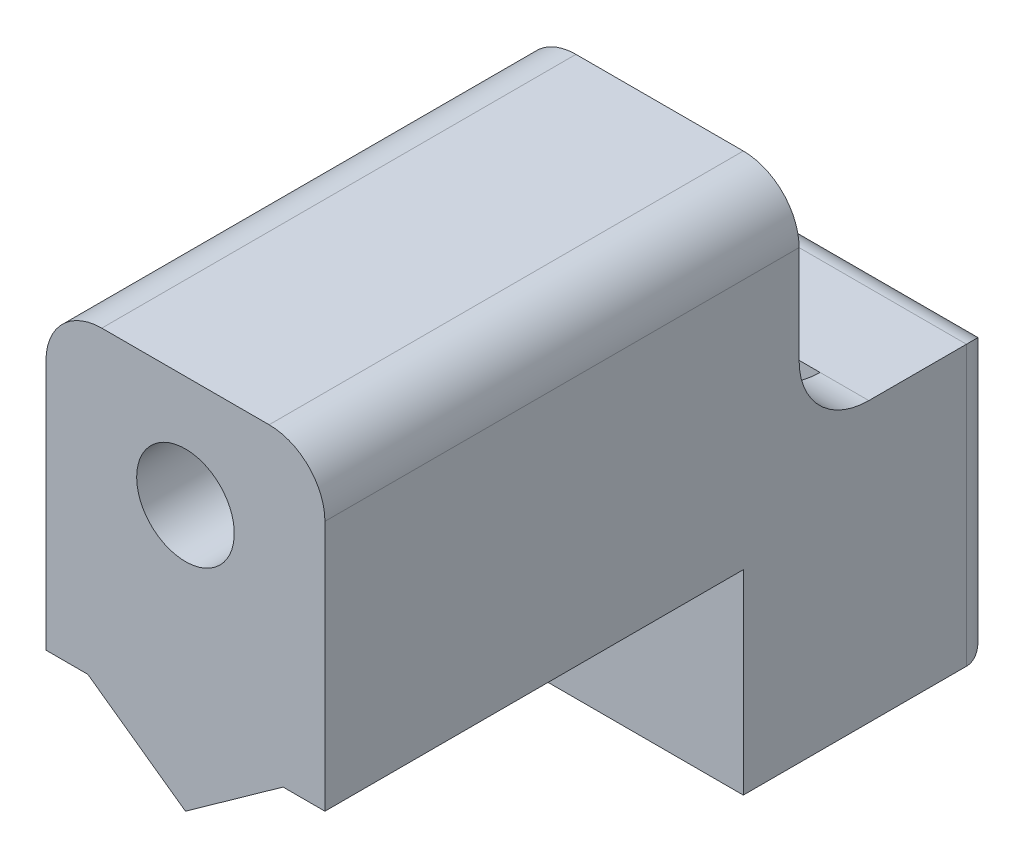
ISO-10303-21;
HEADER;
FILE_DESCRIPTION(('STEP AP214'),'2;1');
FILE_NAME('part.step','',(''),(''),'','','');
FILE_SCHEMA(('AUTOMOTIVE_DESIGN { 1 0 10303 214 1 1 1 1 }'));
ENDSEC;
DATA;
#1=APPLICATION_CONTEXT('core data for automotive mechanical design processes');
#2=APPLICATION_PROTOCOL_DEFINITION('international standard','automotive_design',2000,#1);
#3=PRODUCT_CONTEXT('',#1,'mechanical');
#4=PRODUCT('Part','Part','',(#3));
#5=PRODUCT_RELATED_PRODUCT_CATEGORY('part','',(#4));
#6=PRODUCT_DEFINITION_FORMATION('','',#4);
#7=PRODUCT_DEFINITION_CONTEXT('part definition',#1,'design');
#8=PRODUCT_DEFINITION('design','',#6,#7);
#9=PRODUCT_DEFINITION_SHAPE('','',#8);
#10=(LENGTH_UNIT() NAMED_UNIT(*) SI_UNIT(.MILLI.,.METRE.));
#11=(NAMED_UNIT(*) PLANE_ANGLE_UNIT() SI_UNIT($,.RADIAN.));
#12=(NAMED_UNIT(*) SI_UNIT($,.STERADIAN.) SOLID_ANGLE_UNIT());
#13=UNCERTAINTY_MEASURE_WITH_UNIT(LENGTH_MEASURE(1.E-05),#10,'distance_accuracy_value','');
#14=(GEOMETRIC_REPRESENTATION_CONTEXT(3) GLOBAL_UNCERTAINTY_ASSIGNED_CONTEXT((#13)) GLOBAL_UNIT_ASSIGNED_CONTEXT((#10,
#11,#12)) REPRESENTATION_CONTEXT('',''));
#15=CARTESIAN_POINT('',(0.,0.,0.));
#16=DIRECTION('',(0.,0.,1.));
#17=DIRECTION('',(1.,0.,0.));
#18=AXIS2_PLACEMENT_3D('',#15,#16,#17);
#19=CARTESIAN_POINT('',(-3.5,-4.24999999999999,7.));
#20=DIRECTION('',(0.,1.,0.));
#21=DIRECTION('',(0.,0.,1.));
#22=AXIS2_PLACEMENT_3D('',#19,#20,#21);
#23=PLANE('',#22);
#24=DIRECTION('',(-1.,0.,0.));
#25=VECTOR('',#24,1.);
#26=CARTESIAN_POINT('',(-5.,-4.24999999999999,2.));
#27=LINE('',#26,#25);
#28=CARTESIAN_POINT('',(5.,-4.24999999999999,2.));
#29=VERTEX_POINT('',#28);
#30=CARTESIAN_POINT('',(3.49999999999999,-4.24999999999999,2.));
#31=VERTEX_POINT('',#30);
#32=EDGE_CURVE('E298',#29,#31,#27,.T.);
#33=ORIENTED_EDGE('',*,*,#32,.F.);
#34=DIRECTION('',(0.,0.,-1.));
#35=VECTOR('',#34,1.);
#36=CARTESIAN_POINT('',(5.,-4.24999999999999,7.));
#37=LINE('',#36,#35);
#38=CARTESIAN_POINT('',(5.,-4.24999999999999,17.));
#39=VERTEX_POINT('',#38);
#40=EDGE_CURVE('E444',#39,#29,#37,.T.);
#41=ORIENTED_EDGE('',*,*,#40,.F.);
#42=DIRECTION('',(1.,0.,0.));
#43=VECTOR('',#42,1.);
#44=CARTESIAN_POINT('',(0.,-4.24999999999998,17.));
#45=LINE('',#44,#43);
#46=CARTESIAN_POINT('',(3.5,-4.24999999999999,17.));
#47=VERTEX_POINT('',#46);
#48=EDGE_CURVE('E302',#47,#39,#45,.T.);
#49=ORIENTED_EDGE('',*,*,#48,.F.);
#50=DIRECTION('',(0.,0.,-1.));
#51=VECTOR('',#50,1.);
#52=CARTESIAN_POINT('',(3.5,-4.24999999999999,7.));
#53=LINE('',#52,#51);
#54=EDGE_CURVE('E405',#47,#31,#53,.T.);
#55=ORIENTED_EDGE('',*,*,#54,.T.);
#56=EDGE_LOOP('',(#33,#41,#49,#55));
#57=FACE_BOUND('',#56,.T.);
#58=ADVANCED_FACE('F35',(#57),#23,.F.);
#59=CARTESIAN_POINT('',(-3.5,-4.24999999999999,2.));
#60=VERTEX_POINT('',#59);
#61=CARTESIAN_POINT('',(-5.,-4.24999999999999,2.));
#62=VERTEX_POINT('',#61);
#63=EDGE_CURVE('E297',#60,#62,#27,.T.);
#64=ORIENTED_EDGE('',*,*,#63,.F.);
#65=DIRECTION('',(0.,0.,-1.));
#66=VECTOR('',#65,1.);
#67=CARTESIAN_POINT('',(-3.5,-4.24999999999999,7.));
#68=LINE('',#67,#66);
#69=CARTESIAN_POINT('',(-3.5,-4.24999999999999,17.));
#70=VERTEX_POINT('',#69);
#71=EDGE_CURVE('E455',#70,#60,#68,.T.);
#72=ORIENTED_EDGE('',*,*,#71,.F.);
#73=DIRECTION('',(1.,0.,0.));
#74=VECTOR('',#73,1.);
#75=CARTESIAN_POINT('',(0.,-4.24999999999999,17.));
#76=LINE('',#75,#74);
#77=CARTESIAN_POINT('',(-5.,-4.24999999999999,17.));
#78=VERTEX_POINT('',#77);
#79=EDGE_CURVE('E320',#78,#70,#76,.T.);
#80=ORIENTED_EDGE('',*,*,#79,.F.);
#81=DIRECTION('',(0.,0.,-1.));
#82=VECTOR('',#81,1.);
#83=CARTESIAN_POINT('',(-5.,-4.24999999999999,7.));
#84=LINE('',#83,#82);
#85=EDGE_CURVE('E449',#78,#62,#84,.T.);
#86=ORIENTED_EDGE('',*,*,#85,.T.);
#87=EDGE_LOOP('',(#64,#72,#80,#86));
#88=FACE_BOUND('',#87,.T.);
#89=ADVANCED_FACE('F558',(#88),#23,.F.);
#90=CARTESIAN_POINT('',(3.5,-4.24999999999999,7.));
#91=DIRECTION('',(-0.581238193719097,0.813733471206735,0.));
#92=DIRECTION('',(-0.813733471206735,-0.581238193719097,0.));
#93=AXIS2_PLACEMENT_3D('',#90,#91,#92);
#94=PLANE('',#93);
#95=DIRECTION('',(-0.813733471206735,-0.581238193719097,0.));
#96=VECTOR('',#95,1.);
#97=CARTESIAN_POINT('',(3.5,-4.24999999999999,2.));
#98=LINE('',#97,#96);
#99=CARTESIAN_POINT('',(0.,-6.74999999999999,2.));
#100=VERTEX_POINT('',#99);
#101=EDGE_CURVE('E300',#31,#100,#98,.T.);
#102=ORIENTED_EDGE('',*,*,#101,.F.);
#103=ORIENTED_EDGE('',*,*,#54,.F.);
#104=DIRECTION('',(0.813733471206734,0.581238193719097,0.));
#105=VECTOR('',#104,1.);
#106=CARTESIAN_POINT('',(3.19256756756757,-4.46959459459458,17.));
#107=LINE('',#106,#105);
#108=CARTESIAN_POINT('',(0.,-6.74999999999999,17.));
#109=VERTEX_POINT('',#108);
#110=EDGE_CURVE('E326',#109,#47,#107,.T.);
#111=ORIENTED_EDGE('',*,*,#110,.F.);
#112=DIRECTION('',(0.,0.,-1.));
#113=VECTOR('',#112,1.);
#114=CARTESIAN_POINT('',(0.,-6.74999999999999,7.));
#115=LINE('',#114,#113);
#116=EDGE_CURVE('E460',#109,#100,#115,.T.);
#117=ORIENTED_EDGE('',*,*,#116,.T.);
#118=EDGE_LOOP('',(#102,#103,#111,#117));
#119=FACE_BOUND('',#118,.T.);
#120=ADVANCED_FACE('F546',(#119),#94,.F.);
#121=CARTESIAN_POINT('',(0.,-6.74999999999999,7.));
#122=DIRECTION('',(0.581238193719096,0.813733471206735,0.));
#123=DIRECTION('',(-0.813733471206735,0.581238193719096,0.));
#124=AXIS2_PLACEMENT_3D('',#121,#122,#123);
#125=PLANE('',#124);
#126=DIRECTION('',(-0.813733471206735,0.581238193719096,0.));
#127=VECTOR('',#126,1.);
#128=CARTESIAN_POINT('',(0.,-6.74999999999999,2.));
#129=LINE('',#128,#127);
#130=EDGE_CURVE('E11',#100,#60,#129,.T.);
#131=ORIENTED_EDGE('',*,*,#130,.F.);
#132=ORIENTED_EDGE('',*,*,#116,.F.);
#133=DIRECTION('',(0.813733471206735,-0.581238193719097,0.));
#134=VECTOR('',#133,1.);
#135=CARTESIAN_POINT('',(-3.19256756756757,-4.46959459459459,17.));
#136=LINE('',#135,#134);
#137=EDGE_CURVE('E323',#70,#109,#136,.T.);
#138=ORIENTED_EDGE('',*,*,#137,.F.);
#139=ORIENTED_EDGE('',*,*,#71,.T.);
#140=EDGE_LOOP('',(#131,#132,#138,#139));
#141=FACE_BOUND('',#140,.T.);
#142=ADVANCED_FACE('F548',(#141),#125,.F.);
#143=CARTESIAN_POINT('',(0.,0.,0.));
#144=DIRECTION('',(0.,0.,-1.));
#145=DIRECTION('',(-1.,0.,0.));
#146=AXIS2_PLACEMENT_3D('',#143,#144,#145);
#147=PLANE('',#146);
#148=DIRECTION('',(-1.,0.,0.));
#149=VECTOR('',#148,1.);
#150=CARTESIAN_POINT('',(1.64544826719043,-0.0999999999999942,0.));
#151=LINE('',#150,#149);
#152=CARTESIAN_POINT('',(1.64544826719043,-0.0999999999999942,0.));
#153=VERTEX_POINT('',#152);
#154=CARTESIAN_POINT('',(-1.64544826719043,-0.0999999999999952,0.));
#155=VERTEX_POINT('',#154);
#156=EDGE_CURVE('E50',#153,#155,#151,.T.);
#157=ORIENTED_EDGE('',*,*,#156,.F.);
#158=DIRECTION('',(-0.5,-0.866025403784439,0.));
#159=VECTOR('',#158,1.);
#160=CARTESIAN_POINT('',(3.29089653438087,2.75000000000001,0.));
#161=LINE('',#160,#159);
#162=CARTESIAN_POINT('',(3.29089653438087,2.75000000000001,0.));
#163=VERTEX_POINT('',#162);
#164=EDGE_CURVE('E252',#163,#153,#161,.T.);
#165=ORIENTED_EDGE('',*,*,#164,.F.);
#166=DIRECTION('',(0.5,-0.866025403784439,0.));
#167=VECTOR('',#166,1.);
#168=CARTESIAN_POINT('',(1.64544826719043,5.60000000000001,0.));
#169=LINE('',#168,#167);
#170=CARTESIAN_POINT('',(1.64544826719043,5.60000000000001,0.));
#171=VERTEX_POINT('',#170);
#172=EDGE_CURVE('E255',#171,#163,#169,.T.);
#173=ORIENTED_EDGE('',*,*,#172,.F.);
#174=DIRECTION('',(1.,0.,0.));
#175=VECTOR('',#174,1.);
#176=CARTESIAN_POINT('',(-1.64544826719043,5.60000000000001,0.));
#177=LINE('',#176,#175);
#178=CARTESIAN_POINT('',(-1.64544826719043,5.60000000000001,0.));
#179=VERTEX_POINT('',#178);
#180=EDGE_CURVE('E275',#179,#171,#177,.T.);
#181=ORIENTED_EDGE('',*,*,#180,.F.);
#182=DIRECTION('',(0.5,0.866025403784439,0.));
#183=VECTOR('',#182,1.);
#184=CARTESIAN_POINT('',(-3.29089653438087,2.75000000000001,0.));
#185=LINE('',#184,#183);
#186=CARTESIAN_POINT('',(-3.29089653438087,2.75000000000001,0.));
#187=VERTEX_POINT('',#186);
#188=EDGE_CURVE('E272',#187,#179,#185,.T.);
#189=ORIENTED_EDGE('',*,*,#188,.F.);
#190=DIRECTION('',(-0.5,0.866025403784439,0.));
#191=VECTOR('',#190,1.);
#192=CARTESIAN_POINT('',(-1.64544826719043,-0.0999999999999951,0.));
#193=LINE('',#192,#191);
#194=EDGE_CURVE('E269',#155,#187,#193,.T.);
#195=ORIENTED_EDGE('',*,*,#194,.F.);
#196=EDGE_LOOP('',(#157,#165,#173,#181,#189,#195));
#197=FACE_BOUND('',#196,.T.);
#198=DIRECTION('',(-1.,0.,0.));
#199=VECTOR('',#198,1.);
#200=CARTESIAN_POINT('',(3.25,1.25000000000001,0.));
#201=LINE('',#200,#199);
#202=CARTESIAN_POINT('',(5.,1.25000000000001,0.));
#203=VERTEX_POINT('',#202);
#204=CARTESIAN_POINT('',(3.25,1.25,0.));
#205=VERTEX_POINT('',#204);
#206=EDGE_CURVE('E404',#203,#205,#201,.T.);
#207=ORIENTED_EDGE('',*,*,#206,.T.);
#208=DIRECTION('',(0.,-1.,0.));
#209=VECTOR('',#208,1.);
#210=CARTESIAN_POINT('',(3.25,0.,0.));
#211=LINE('',#210,#209);
#212=CARTESIAN_POINT('',(3.25,-7.44999999999999,0.));
#213=VERTEX_POINT('',#212);
#214=EDGE_CURVE('E360',#205,#213,#211,.T.);
#215=ORIENTED_EDGE('',*,*,#214,.T.);
#216=DIRECTION('',(1.,0.,0.));
#217=VECTOR('',#216,1.);
#218=CARTESIAN_POINT('',(-3.25,-7.44999999999999,0.));
#219=LINE('',#218,#217);
#220=CARTESIAN_POINT('',(-3.25,-7.44999999999999,0.));
#221=VERTEX_POINT('',#220);
#222=EDGE_CURVE('E330',#221,#213,#219,.T.);
#223=ORIENTED_EDGE('',*,*,#222,.F.);
#224=DIRECTION('',(0.,1.,0.));
#225=VECTOR('',#224,1.);
#226=CARTESIAN_POINT('',(-3.25,0.,0.));
#227=LINE('',#226,#225);
#228=CARTESIAN_POINT('',(-3.25,1.25,0.));
#229=VERTEX_POINT('',#228);
#230=EDGE_CURVE('E362',#221,#229,#227,.T.);
#231=ORIENTED_EDGE('',*,*,#230,.T.);
#232=DIRECTION('',(-1.,0.,0.));
#233=VECTOR('',#232,1.);
#234=CARTESIAN_POINT('',(-5.,1.25000000000001,0.));
#235=LINE('',#234,#233);
#236=CARTESIAN_POINT('',(-5.,1.25000000000001,0.));
#237=VERTEX_POINT('',#236);
#238=EDGE_CURVE('E401',#229,#237,#235,.T.);
#239=ORIENTED_EDGE('',*,*,#238,.T.);
#240=DIRECTION('',(0.,-1.,0.));
#241=VECTOR('',#240,1.);
#242=CARTESIAN_POINT('',(-5.,-4.24999999999999,0.));
#243=LINE('',#242,#241);
#244=CARTESIAN_POINT('',(-5.,4.74999999999999,0.));
#245=VERTEX_POINT('',#244);
#246=EDGE_CURVE('E466',#245,#237,#243,.T.);
#247=ORIENTED_EDGE('',*,*,#246,.F.);
#248=CARTESIAN_POINT('',(-3.,4.74999999999999,0.));
#249=DIRECTION('',(0.,0.,-1.));
#250=DIRECTION('',(-1.,0.,0.));
#251=AXIS2_PLACEMENT_3D('',#248,#249,#250);
#252=CIRCLE('',#251,2.);
#253=CARTESIAN_POINT('',(-3.,6.74999999999999,0.));
#254=VERTEX_POINT('',#253);
#255=EDGE_CURVE('E58',#245,#254,#252,.T.);
#256=ORIENTED_EDGE('',*,*,#255,.T.);
#257=DIRECTION('',(-1.,0.,0.));
#258=VECTOR('',#257,1.);
#259=CARTESIAN_POINT('',(-5.,6.74999999999999,0.));
#260=LINE('',#259,#258);
#261=CARTESIAN_POINT('',(3.,6.74999999999999,0.));
#262=VERTEX_POINT('',#261);
#263=EDGE_CURVE('E391',#262,#254,#260,.T.);
#264=ORIENTED_EDGE('',*,*,#263,.F.);
#265=CARTESIAN_POINT('',(3.,4.74999999999999,0.));
#266=DIRECTION('',(0.,0.,-1.));
#267=DIRECTION('',(-1.,0.,0.));
#268=AXIS2_PLACEMENT_3D('',#265,#266,#267);
#269=CIRCLE('',#268,2.);
#270=CARTESIAN_POINT('',(5.,4.74999999999999,0.));
#271=VERTEX_POINT('',#270);
#272=EDGE_CURVE('E477',#262,#271,#269,.T.);
#273=ORIENTED_EDGE('',*,*,#272,.T.);
#274=DIRECTION('',(0.,1.,0.));
#275=VECTOR('',#274,1.);
#276=CARTESIAN_POINT('',(5.,6.74999999999999,0.));
#277=LINE('',#276,#275);
#278=EDGE_CURVE('E394',#203,#271,#277,.T.);
#279=ORIENTED_EDGE('',*,*,#278,.F.);
#280=EDGE_LOOP('',(#207,#215,#223,#231,#239,#247,#256,#264,#273,#279));
#281=FACE_BOUND('',#280,.T.);
#282=ADVANCED_FACE('F487',(#197,#281),#147,.T.);
#283=CARTESIAN_POINT('',(5.,6.74999999999999,7.));
#284=DIRECTION('',(-1.,0.,0.));
#285=DIRECTION('',(0.,0.,1.));
#286=AXIS2_PLACEMENT_3D('',#283,#284,#285);
#287=PLANE('',#286);
#288=ORIENTED_EDGE('',*,*,#278,.T.);
#289=DIRECTION('',(0.,0.,-1.));
#290=VECTOR('',#289,1.);
#291=CARTESIAN_POINT('',(5.,4.74999999999999,7.));
#292=LINE('',#291,#290);
#293=CARTESIAN_POINT('',(5.,4.74999999999999,17.));
#294=VERTEX_POINT('',#293);
#295=EDGE_CURVE('E479',#271,#294,#292,.F.);
#296=ORIENTED_EDGE('',*,*,#295,.T.);
#297=DIRECTION('',(0.,1.,0.));
#298=VECTOR('',#297,1.);
#299=CARTESIAN_POINT('',(5.,0.,17.));
#300=LINE('',#299,#298);
#301=EDGE_CURVE('E305',#39,#294,#300,.T.);
#302=ORIENTED_EDGE('',*,*,#301,.F.);
#303=ORIENTED_EDGE('',*,*,#40,.T.);
#304=DIRECTION('',(0.,1.,0.));
#305=VECTOR('',#304,1.);
#306=CARTESIAN_POINT('',(5.,-11.25,2.));
#307=LINE('',#306,#305);
#308=CARTESIAN_POINT('',(5.,-11.25,2.));
#309=VERTEX_POINT('',#308);
#310=EDGE_CURVE('E295',#309,#29,#307,.T.);
#311=ORIENTED_EDGE('',*,*,#310,.F.);
#312=DIRECTION('',(0.,0.,1.));
#313=VECTOR('',#312,1.);
#314=CARTESIAN_POINT('',(5.,-11.25,-7.));
#315=LINE('',#314,#313);
#316=CARTESIAN_POINT('',(5.,-11.25,-6.));
#317=VERTEX_POINT('',#316);
#318=EDGE_CURVE('E378',#317,#309,#315,.T.);
#319=ORIENTED_EDGE('',*,*,#318,.F.);
#320=DIRECTION('',(0.,-1.,0.));
#321=VECTOR('',#320,1.);
#322=CARTESIAN_POINT('',(5.,-1.24999999999999,-6.));
#323=LINE('',#322,#321);
#324=CARTESIAN_POINT('',(5.,-1.24999999999999,-6.));
#325=VERTEX_POINT('',#324);
#326=EDGE_CURVE('E435',#317,#325,#323,.F.);
#327=ORIENTED_EDGE('',*,*,#326,.T.);
#328=DIRECTION('',(0.,0.,1.));
#329=VECTOR('',#328,1.);
#330=CARTESIAN_POINT('',(5.,-1.24999999999999,-7.));
#331=LINE('',#330,#329);
#332=CARTESIAN_POINT('',(5.,-1.24999999999999,-2.5));
#333=VERTEX_POINT('',#332);
#334=EDGE_CURVE('E398',#325,#333,#331,.T.);
#335=ORIENTED_EDGE('',*,*,#334,.T.);
#336=CARTESIAN_POINT('',(5.,1.25000000000001,-2.5));
#337=DIRECTION('',(-1.,0.,0.));
#338=DIRECTION('',(0.,0.,1.));
#339=AXIS2_PLACEMENT_3D('',#336,#337,#338);
#340=CIRCLE('',#339,2.5);
#341=EDGE_CURVE('E415',#333,#203,#340,.T.);
#342=ORIENTED_EDGE('',*,*,#341,.T.);
#343=EDGE_LOOP('',(#288,#296,#302,#303,#311,#319,#327,#335,#342));
#344=FACE_BOUND('',#343,.T.);
#345=ADVANCED_FACE('F538',(#344),#287,.F.);
#346=CARTESIAN_POINT('',(-5.,6.74999999999999,7.));
#347=DIRECTION('',(0.,-1.,0.));
#348=DIRECTION('',(0.,0.,-1.));
#349=AXIS2_PLACEMENT_3D('',#346,#347,#348);
#350=PLANE('',#349);
#351=DIRECTION('',(0.,0.,-1.));
#352=VECTOR('',#351,1.);
#353=CARTESIAN_POINT('',(-3.,6.74999999999999,7.));
#354=LINE('',#353,#352);
#355=CARTESIAN_POINT('',(-3.,6.74999999999999,17.));
#356=VERTEX_POINT('',#355);
#357=EDGE_CURVE('E517',#254,#356,#354,.F.);
#358=ORIENTED_EDGE('',*,*,#357,.T.);
#359=DIRECTION('',(-1.,0.,0.));
#360=VECTOR('',#359,1.);
#361=CARTESIAN_POINT('',(0.,6.74999999999999,17.));
#362=LINE('',#361,#360);
#363=CARTESIAN_POINT('',(3.,6.74999999999999,17.));
#364=VERTEX_POINT('',#363);
#365=EDGE_CURVE('E311',#364,#356,#362,.T.);
#366=ORIENTED_EDGE('',*,*,#365,.F.);
#367=DIRECTION('',(0.,0.,-1.));
#368=VECTOR('',#367,1.);
#369=CARTESIAN_POINT('',(3.,6.74999999999999,7.));
#370=LINE('',#369,#368);
#371=EDGE_CURVE('E474',#364,#262,#370,.T.);
#372=ORIENTED_EDGE('',*,*,#371,.T.);
#373=ORIENTED_EDGE('',*,*,#263,.T.);
#374=EDGE_LOOP('',(#358,#366,#372,#373));
#375=FACE_BOUND('',#374,.T.);
#376=ADVANCED_FACE('F571',(#375),#350,.F.);
#377=CARTESIAN_POINT('',(-5.,-4.24999999999999,7.));
#378=DIRECTION('',(1.,0.,0.));
#379=DIRECTION('',(0.,0.,-1.));
#380=AXIS2_PLACEMENT_3D('',#377,#378,#379);
#381=PLANE('',#380);
#382=ORIENTED_EDGE('',*,*,#85,.F.);
#383=DIRECTION('',(0.,-1.,0.));
#384=VECTOR('',#383,1.);
#385=CARTESIAN_POINT('',(-5.,0.,17.));
#386=LINE('',#385,#384);
#387=CARTESIAN_POINT('',(-5.,4.74999999999999,17.));
#388=VERTEX_POINT('',#387);
#389=EDGE_CURVE('E317',#388,#78,#386,.T.);
#390=ORIENTED_EDGE('',*,*,#389,.F.);
#391=DIRECTION('',(0.,0.,-1.));
#392=VECTOR('',#391,1.);
#393=CARTESIAN_POINT('',(-5.,4.74999999999999,7.));
#394=LINE('',#393,#392);
#395=EDGE_CURVE('E43',#388,#245,#394,.T.);
#396=ORIENTED_EDGE('',*,*,#395,.T.);
#397=ORIENTED_EDGE('',*,*,#246,.T.);
#398=CARTESIAN_POINT('',(-5.,1.25000000000001,-2.5));
#399=DIRECTION('',(1.,0.,0.));
#400=DIRECTION('',(0.,0.,-1.));
#401=AXIS2_PLACEMENT_3D('',#398,#399,#400);
#402=CIRCLE('',#401,2.5);
#403=CARTESIAN_POINT('',(-5.,-1.24999999999999,-2.5));
#404=VERTEX_POINT('',#403);
#405=EDGE_CURVE('E417',#237,#404,#402,.T.);
#406=ORIENTED_EDGE('',*,*,#405,.T.);
#407=DIRECTION('',(0.,0.,1.));
#408=VECTOR('',#407,1.);
#409=CARTESIAN_POINT('',(-5.,-1.24999999999999,-7.));
#410=LINE('',#409,#408);
#411=CARTESIAN_POINT('',(-5.,-1.24999999999999,-6.));
#412=VERTEX_POINT('',#411);
#413=EDGE_CURVE('E388',#412,#404,#410,.T.);
#414=ORIENTED_EDGE('',*,*,#413,.F.);
#415=DIRECTION('',(0.,1.,0.));
#416=VECTOR('',#415,1.);
#417=CARTESIAN_POINT('',(-5.,-11.25,-6.));
#418=LINE('',#417,#416);
#419=CARTESIAN_POINT('',(-5.,-11.25,-6.));
#420=VERTEX_POINT('',#419);
#421=EDGE_CURVE('E499',#412,#420,#418,.F.);
#422=ORIENTED_EDGE('',*,*,#421,.T.);
#423=DIRECTION('',(0.,0.,-1.));
#424=VECTOR('',#423,1.);
#425=CARTESIAN_POINT('',(-5.,-11.25,-7.));
#426=LINE('',#425,#424);
#427=CARTESIAN_POINT('',(-5.,-11.25,2.));
#428=VERTEX_POINT('',#427);
#429=EDGE_CURVE('E385',#428,#420,#426,.T.);
#430=ORIENTED_EDGE('',*,*,#429,.F.);
#431=DIRECTION('',(0.,-1.,0.));
#432=VECTOR('',#431,1.);
#433=CARTESIAN_POINT('',(-5.,-11.25,2.));
#434=LINE('',#433,#432);
#435=EDGE_CURVE('E282',#62,#428,#434,.T.);
#436=ORIENTED_EDGE('',*,*,#435,.F.);
#437=EDGE_LOOP('',(#382,#390,#396,#397,#406,#414,#422,#430,#436));
#438=FACE_BOUND('',#437,.T.);
#439=ADVANCED_FACE('F483',(#438),#381,.F.);
#440=CARTESIAN_POINT('',(0.,-1.24999999999999,-7.));
#441=DIRECTION('',(0.,1.,0.));
#442=DIRECTION('',(-1.,0.,0.));
#443=AXIS2_PLACEMENT_3D('',#440,#441,#442);
#444=PLANE('',#443);
#445=ORIENTED_EDGE('',*,*,#334,.F.);
#446=DIRECTION('',(-1.,0.,0.));
#447=VECTOR('',#446,1.);
#448=CARTESIAN_POINT('',(0.,-1.24999999999999,-6.));
#449=LINE('',#448,#447);
#450=EDGE_CURVE('E507',#325,#412,#449,.T.);
#451=ORIENTED_EDGE('',*,*,#450,.T.);
#452=ORIENTED_EDGE('',*,*,#413,.T.);
#453=DIRECTION('',(-1.,0.,0.));
#454=VECTOR('',#453,1.);
#455=CARTESIAN_POINT('',(-3.25,-1.24999999999999,-2.5));
#456=LINE('',#455,#454);
#457=CARTESIAN_POINT('',(-3.25,-1.24999999999999,-2.5));
#458=VERTEX_POINT('',#457);
#459=EDGE_CURVE('E408',#404,#458,#456,.F.);
#460=ORIENTED_EDGE('',*,*,#459,.T.);
#461=DIRECTION('',(-1.,0.,0.));
#462=VECTOR('',#461,1.);
#463=CARTESIAN_POINT('',(3.25,-1.24999999999999,-2.5));
#464=LINE('',#463,#462);
#465=CARTESIAN_POINT('',(3.25,-1.24999999999999,-2.5));
#466=VERTEX_POINT('',#465);
#467=EDGE_CURVE('E334',#466,#458,#464,.T.);
#468=ORIENTED_EDGE('',*,*,#467,.F.);
#469=DIRECTION('',(-1.,0.,0.));
#470=VECTOR('',#469,1.);
#471=CARTESIAN_POINT('',(5.,-1.24999999999999,-2.5));
#472=LINE('',#471,#470);
#473=EDGE_CURVE('E410',#466,#333,#472,.F.);
#474=ORIENTED_EDGE('',*,*,#473,.T.);
#475=EDGE_LOOP('',(#445,#451,#452,#460,#468,#474));
#476=FACE_BOUND('',#475,.T.);
#477=ADVANCED_FACE('F570',(#476),#444,.T.);
#478=CARTESIAN_POINT('',(0.,0.,-7.));
#479=DIRECTION('',(0.,0.,-1.));
#480=DIRECTION('',(-1.,0.,0.));
#481=AXIS2_PLACEMENT_3D('',#478,#479,#480);
#482=PLANE('',#481);
#483=DIRECTION('',(0.,-1.,0.));
#484=VECTOR('',#483,1.);
#485=CARTESIAN_POINT('',(4.,-11.25,-7.));
#486=LINE('',#485,#484);
#487=CARTESIAN_POINT('',(4.,-2.24999999999999,-7.));
#488=VERTEX_POINT('',#487);
#489=CARTESIAN_POINT('',(4.,-10.25,-7.));
#490=VERTEX_POINT('',#489);
#491=EDGE_CURVE('E430',#488,#490,#486,.T.);
#492=ORIENTED_EDGE('',*,*,#491,.T.);
#493=DIRECTION('',(1.,0.,0.));
#494=VECTOR('',#493,1.);
#495=CARTESIAN_POINT('',(0.,-10.25,-7.));
#496=LINE('',#495,#494);
#497=CARTESIAN_POINT('',(-4.,-10.25,-7.));
#498=VERTEX_POINT('',#497);
#499=EDGE_CURVE('E432',#490,#498,#496,.F.);
#500=ORIENTED_EDGE('',*,*,#499,.T.);
#501=DIRECTION('',(0.,1.,0.));
#502=VECTOR('',#501,1.);
#503=CARTESIAN_POINT('',(-4.,-1.24999999999999,-7.));
#504=LINE('',#503,#502);
#505=CARTESIAN_POINT('',(-4.,-2.24999999999999,-7.));
#506=VERTEX_POINT('',#505);
#507=EDGE_CURVE('E426',#498,#506,#504,.T.);
#508=ORIENTED_EDGE('',*,*,#507,.T.);
#509=DIRECTION('',(-1.,0.,0.));
#510=VECTOR('',#509,1.);
#511=CARTESIAN_POINT('',(0.,-2.24999999999999,-7.));
#512=LINE('',#511,#510);
#513=EDGE_CURVE('E428',#506,#488,#512,.F.);
#514=ORIENTED_EDGE('',*,*,#513,.T.);
#515=EDGE_LOOP('',(#492,#500,#508,#514));
#516=FACE_BOUND('',#515,.T.);
#517=DIRECTION('',(1.,0.,0.));
#518=VECTOR('',#517,1.);
#519=CARTESIAN_POINT('',(0.,-4.93526023723731,-7.));
#520=LINE('',#519,#518);
#521=CARTESIAN_POINT('',(-3.25,-4.93526023723731,-7.));
#522=VERTEX_POINT('',#521);
#523=CARTESIAN_POINT('',(3.25,-4.93526023723731,-7.));
#524=VERTEX_POINT('',#523);
#525=EDGE_CURVE('E359',#522,#524,#520,.T.);
#526=ORIENTED_EDGE('',*,*,#525,.F.);
#527=DIRECTION('',(0.,1.,0.));
#528=VECTOR('',#527,1.);
#529=CARTESIAN_POINT('',(-3.25,0.,-7.));
#530=LINE('',#529,#528);
#531=CARTESIAN_POINT('',(-3.25,-7.43526023723731,-7.));
#532=VERTEX_POINT('',#531);
#533=EDGE_CURVE('E363',#532,#522,#530,.T.);
#534=ORIENTED_EDGE('',*,*,#533,.F.);
#535=DIRECTION('',(-1.,0.,0.));
#536=VECTOR('',#535,1.);
#537=CARTESIAN_POINT('',(0.,-7.43526023723731,-7.));
#538=LINE('',#537,#536);
#539=CARTESIAN_POINT('',(3.25,-7.43526023723731,-7.));
#540=VERTEX_POINT('',#539);
#541=EDGE_CURVE('E371',#540,#532,#538,.T.);
#542=ORIENTED_EDGE('',*,*,#541,.F.);
#543=DIRECTION('',(0.,-1.,0.));
#544=VECTOR('',#543,1.);
#545=CARTESIAN_POINT('',(3.25,0.,-7.));
#546=LINE('',#545,#544);
#547=EDGE_CURVE('E368',#524,#540,#546,.T.);
#548=ORIENTED_EDGE('',*,*,#547,.F.);
#549=EDGE_LOOP('',(#526,#534,#542,#548));
#550=FACE_BOUND('',#549,.T.);
#551=ADVANCED_FACE('F530',(#516,#550),#482,.T.);
#552=CARTESIAN_POINT('',(0.,-11.25,0.));
#553=DIRECTION('',(0.,-1.,0.));
#554=DIRECTION('',(0.,0.,-1.));
#555=AXIS2_PLACEMENT_3D('',#552,#553,#554);
#556=PLANE('',#555);
#557=ORIENTED_EDGE('',*,*,#429,.T.);
#558=DIRECTION('',(1.,0.,0.));
#559=VECTOR('',#558,1.);
#560=CARTESIAN_POINT('',(0.,-11.25,-6.));
#561=LINE('',#560,#559);
#562=EDGE_CURVE('E423',#420,#317,#561,.T.);
#563=ORIENTED_EDGE('',*,*,#562,.T.);
#564=ORIENTED_EDGE('',*,*,#318,.T.);
#565=DIRECTION('',(1.,0.,0.));
#566=VECTOR('',#565,1.);
#567=CARTESIAN_POINT('',(-5.,-11.25,2.));
#568=LINE('',#567,#566);
#569=EDGE_CURVE('E292',#428,#309,#568,.T.);
#570=ORIENTED_EDGE('',*,*,#569,.F.);
#571=EDGE_LOOP('',(#557,#563,#564,#570));
#572=FACE_BOUND('',#571,.T.);
#573=ADVANCED_FACE('F536',(#572),#556,.T.);
#574=CARTESIAN_POINT('',(0.,-4.93526023723731,0.));
#575=DIRECTION('',(0.,1.,0.));
#576=DIRECTION('',(-1.,0.,0.));
#577=AXIS2_PLACEMENT_3D('',#574,#575,#576);
#578=PLANE('',#577);
#579=DIRECTION('',(0.,0.,-1.));
#580=VECTOR('',#579,1.);
#581=CARTESIAN_POINT('',(3.25,-4.93526023723731,0.));
#582=LINE('',#581,#580);
#583=CARTESIAN_POINT('',(3.25,-4.93526023723731,-2.5));
#584=VERTEX_POINT('',#583);
#585=EDGE_CURVE('E365',#584,#524,#582,.T.);
#586=ORIENTED_EDGE('',*,*,#585,.F.);
#587=DIRECTION('',(-1.,0.,0.));
#588=VECTOR('',#587,1.);
#589=CARTESIAN_POINT('',(0.,-4.93526023723731,-2.5));
#590=LINE('',#589,#588);
#591=CARTESIAN_POINT('',(-3.25,-4.93526023723731,-2.5));
#592=VERTEX_POINT('',#591);
#593=EDGE_CURVE('E356',#584,#592,#590,.T.);
#594=ORIENTED_EDGE('',*,*,#593,.T.);
#595=DIRECTION('',(0.,0.,-1.));
#596=VECTOR('',#595,1.);
#597=CARTESIAN_POINT('',(-3.25,-4.93526023723731,0.));
#598=LINE('',#597,#596);
#599=EDGE_CURVE('E376',#592,#522,#598,.T.);
#600=ORIENTED_EDGE('',*,*,#599,.T.);
#601=ORIENTED_EDGE('',*,*,#525,.T.);
#602=EDGE_LOOP('',(#586,#594,#600,#601));
#603=FACE_BOUND('',#602,.T.);
#604=ADVANCED_FACE('F633',(#603),#578,.F.);
#605=CARTESIAN_POINT('',(-3.25,0.,0.));
#606=DIRECTION('',(-1.,0.,0.));
#607=DIRECTION('',(0.,-1.,0.));
#608=AXIS2_PLACEMENT_3D('',#605,#606,#607);
#609=PLANE('',#608);
#610=ORIENTED_EDGE('',*,*,#599,.F.);
#611=DIRECTION('',(0.,1.,0.));
#612=VECTOR('',#611,1.);
#613=CARTESIAN_POINT('',(-3.25,-7.44999999999999,-2.5));
#614=LINE('',#613,#612);
#615=EDGE_CURVE('E351',#592,#458,#614,.T.);
#616=ORIENTED_EDGE('',*,*,#615,.T.);
#617=CARTESIAN_POINT('',(-3.25,1.25000000000001,-2.5));
#618=DIRECTION('',(-1.,0.,0.));
#619=DIRECTION('',(0.,-1.,0.));
#620=AXIS2_PLACEMENT_3D('',#617,#618,#619);
#621=CIRCLE('',#620,2.5);
#622=EDGE_CURVE('E420',#458,#229,#621,.T.);
#623=ORIENTED_EDGE('',*,*,#622,.T.);
#624=ORIENTED_EDGE('',*,*,#230,.F.);
#625=DIRECTION('',(0.,0.,1.));
#626=VECTOR('',#625,1.);
#627=CARTESIAN_POINT('',(-3.25,-7.44999999999999,-2.5));
#628=LINE('',#627,#626);
#629=CARTESIAN_POINT('',(-3.25,-7.44999999999999,-2.5));
#630=VERTEX_POINT('',#629);
#631=EDGE_CURVE('E340',#630,#221,#628,.T.);
#632=ORIENTED_EDGE('',*,*,#631,.F.);
#633=CARTESIAN_POINT('',(-3.25,-7.43526023723731,-2.5));
#634=VERTEX_POINT('',#633);
#635=EDGE_CURVE('E347',#630,#634,#614,.T.);
#636=ORIENTED_EDGE('',*,*,#635,.T.);
#637=DIRECTION('',(0.,0.,-1.));
#638=VECTOR('',#637,1.);
#639=CARTESIAN_POINT('',(-3.25,-7.43526023723731,0.));
#640=LINE('',#639,#638);
#641=EDGE_CURVE('E379',#634,#532,#640,.T.);
#642=ORIENTED_EDGE('',*,*,#641,.T.);
#643=ORIENTED_EDGE('',*,*,#533,.T.);
#644=EDGE_LOOP('',(#610,#616,#623,#624,#632,#636,#642,#643));
#645=FACE_BOUND('',#644,.T.);
#646=ADVANCED_FACE('F618',(#645),#609,.F.);
#647=CARTESIAN_POINT('',(0.,-7.43526023723731,0.));
#648=DIRECTION('',(0.,-1.,0.));
#649=DIRECTION('',(0.,0.,-1.));
#650=AXIS2_PLACEMENT_3D('',#647,#648,#649);
#651=PLANE('',#650);
#652=ORIENTED_EDGE('',*,*,#641,.F.);
#653=DIRECTION('',(1.,0.,0.));
#654=VECTOR('',#653,1.);
#655=CARTESIAN_POINT('',(0.,-7.43526023723731,-2.5));
#656=LINE('',#655,#654);
#657=CARTESIAN_POINT('',(3.25,-7.43526023723731,-2.5));
#658=VERTEX_POINT('',#657);
#659=EDGE_CURVE('E350',#634,#658,#656,.T.);
#660=ORIENTED_EDGE('',*,*,#659,.T.);
#661=DIRECTION('',(0.,0.,-1.));
#662=VECTOR('',#661,1.);
#663=CARTESIAN_POINT('',(3.25,-7.43526023723731,0.));
#664=LINE('',#663,#662);
#665=EDGE_CURVE('E381',#658,#540,#664,.T.);
#666=ORIENTED_EDGE('',*,*,#665,.T.);
#667=ORIENTED_EDGE('',*,*,#541,.T.);
#668=EDGE_LOOP('',(#652,#660,#666,#667));
#669=FACE_BOUND('',#668,.T.);
#670=ADVANCED_FACE('F639',(#669),#651,.F.);
#671=CARTESIAN_POINT('',(3.25,0.,0.));
#672=DIRECTION('',(1.,0.,0.));
#673=DIRECTION('',(0.,1.,0.));
#674=AXIS2_PLACEMENT_3D('',#671,#672,#673);
#675=PLANE('',#674);
#676=ORIENTED_EDGE('',*,*,#665,.F.);
#677=DIRECTION('',(0.,1.,0.));
#678=VECTOR('',#677,1.);
#679=CARTESIAN_POINT('',(3.25,-7.44999999999999,-2.5));
#680=LINE('',#679,#678);
#681=CARTESIAN_POINT('',(3.25,-7.44999999999999,-2.5));
#682=VERTEX_POINT('',#681);
#683=EDGE_CURVE('E352',#682,#658,#680,.T.);
#684=ORIENTED_EDGE('',*,*,#683,.F.);
#685=DIRECTION('',(0.,0.,-1.));
#686=VECTOR('',#685,1.);
#687=CARTESIAN_POINT('',(3.25,-7.44999999999999,0.));
#688=LINE('',#687,#686);
#689=EDGE_CURVE('E333',#213,#682,#688,.T.);
#690=ORIENTED_EDGE('',*,*,#689,.F.);
#691=ORIENTED_EDGE('',*,*,#214,.F.);
#692=CARTESIAN_POINT('',(3.25,1.25000000000001,-2.5));
#693=DIRECTION('',(1.,0.,0.));
#694=DIRECTION('',(0.,1.,0.));
#695=AXIS2_PLACEMENT_3D('',#692,#693,#694);
#696=CIRCLE('',#695,2.5);
#697=EDGE_CURVE('E413',#205,#466,#696,.T.);
#698=ORIENTED_EDGE('',*,*,#697,.T.);
#699=EDGE_CURVE('E343',#584,#466,#680,.T.);
#700=ORIENTED_EDGE('',*,*,#699,.F.);
#701=ORIENTED_EDGE('',*,*,#585,.T.);
#702=ORIENTED_EDGE('',*,*,#547,.T.);
#703=EDGE_LOOP('',(#676,#684,#690,#691,#698,#700,#701,#702));
#704=FACE_BOUND('',#703,.T.);
#705=ADVANCED_FACE('F612',(#704),#675,.F.);
#706=CARTESIAN_POINT('',(3.25,-7.44999999999999,-2.5));
#707=DIRECTION('',(0.,0.,-1.));
#708=DIRECTION('',(-1.,0.,0.));
#709=AXIS2_PLACEMENT_3D('',#706,#707,#708);
#710=PLANE('',#709);
#711=ORIENTED_EDGE('',*,*,#635,.F.);
#712=DIRECTION('',(-1.,0.,0.));
#713=VECTOR('',#712,1.);
#714=CARTESIAN_POINT('',(3.25,-7.44999999999999,-2.5));
#715=LINE('',#714,#713);
#716=EDGE_CURVE('E337',#682,#630,#715,.T.);
#717=ORIENTED_EDGE('',*,*,#716,.F.);
#718=ORIENTED_EDGE('',*,*,#683,.T.);
#719=ORIENTED_EDGE('',*,*,#659,.F.);
#720=EDGE_LOOP('',(#711,#717,#718,#719));
#721=FACE_BOUND('',#720,.T.);
#722=ADVANCED_FACE('F615',(#721),#710,.F.);
#723=CARTESIAN_POINT('',(0.,-7.44999999999999,0.));
#724=DIRECTION('',(0.,1.,0.));
#725=DIRECTION('',(-1.,0.,0.));
#726=AXIS2_PLACEMENT_3D('',#723,#724,#725);
#727=PLANE('',#726);
#728=ORIENTED_EDGE('',*,*,#222,.T.);
#729=ORIENTED_EDGE('',*,*,#689,.T.);
#730=ORIENTED_EDGE('',*,*,#716,.T.);
#731=ORIENTED_EDGE('',*,*,#631,.T.);
#732=EDGE_LOOP('',(#728,#729,#730,#731));
#733=FACE_BOUND('',#732,.T.);
#734=ADVANCED_FACE('F609',(#733),#727,.T.);
#735=ORIENTED_EDGE('',*,*,#699,.T.);
#736=ORIENTED_EDGE('',*,*,#467,.T.);
#737=ORIENTED_EDGE('',*,*,#615,.F.);
#738=ORIENTED_EDGE('',*,*,#593,.F.);
#739=EDGE_LOOP('',(#735,#736,#737,#738));
#740=FACE_BOUND('',#739,.T.);
#741=ADVANCED_FACE('F580',(#740),#710,.F.);
#742=CARTESIAN_POINT('',(0.,1.25000000000001,-2.5));
#743=DIRECTION('',(1.,0.,0.));
#744=DIRECTION('',(0.,1.,0.));
#745=AXIS2_PLACEMENT_3D('',#742,#743,#744);
#746=CYLINDRICAL_SURFACE('',#745,2.5);
#747=ORIENTED_EDGE('',*,*,#341,.F.);
#748=ORIENTED_EDGE('',*,*,#473,.F.);
#749=ORIENTED_EDGE('',*,*,#697,.F.);
#750=ORIENTED_EDGE('',*,*,#206,.F.);
#751=EDGE_LOOP('',(#747,#748,#749,#750));
#752=FACE_BOUND('',#751,.T.);
#753=ADVANCED_FACE('F577',(#752),#746,.F.);
#754=CARTESIAN_POINT('',(0.,1.25000000000001,-2.5));
#755=DIRECTION('',(1.,0.,0.));
#756=DIRECTION('',(0.,1.,0.));
#757=AXIS2_PLACEMENT_3D('',#754,#755,#756);
#758=CYLINDRICAL_SURFACE('',#757,2.5);
#759=ORIENTED_EDGE('',*,*,#622,.F.);
#760=ORIENTED_EDGE('',*,*,#459,.F.);
#761=ORIENTED_EDGE('',*,*,#405,.F.);
#762=ORIENTED_EDGE('',*,*,#238,.F.);
#763=EDGE_LOOP('',(#759,#760,#761,#762));
#764=FACE_BOUND('',#763,.T.);
#765=ADVANCED_FACE('F494',(#764),#758,.F.);
#766=CARTESIAN_POINT('',(0.,-2.24999999999999,-6.));
#767=DIRECTION('',(-1.,0.,0.));
#768=DIRECTION('',(0.,-1.,0.));
#769=AXIS2_PLACEMENT_3D('',#766,#767,#768);
#770=CYLINDRICAL_SURFACE('',#769,1.);
#771=CARTESIAN_POINT('',(4.,-2.24999999999999,-6.));
#772=DIRECTION('',(-0.707106781186547,0.707106781186547,0.));
#773=DIRECTION('',(-0.707106781186548,-0.707106781186547,0.));
#774=AXIS2_PLACEMENT_3D('',#771,#772,#773);
#775=ELLIPSE('',#774,1.41421356237309,1.);
#776=EDGE_CURVE('E511',#488,#325,#775,.F.);
#777=ORIENTED_EDGE('',*,*,#776,.F.);
#778=ORIENTED_EDGE('',*,*,#513,.F.);
#779=CARTESIAN_POINT('',(-4.,-2.24999999999999,-6.));
#780=DIRECTION('',(-0.707106781186548,-0.707106781186547,0.));
#781=DIRECTION('',(0.707106781186547,-0.707106781186547,0.));
#782=AXIS2_PLACEMENT_3D('',#779,#780,#781);
#783=ELLIPSE('',#782,1.4142135623731,1.);
#784=EDGE_CURVE('E346',#412,#506,#783,.T.);
#785=ORIENTED_EDGE('',*,*,#784,.F.);
#786=ORIENTED_EDGE('',*,*,#450,.F.);
#787=EDGE_LOOP('',(#777,#778,#785,#786));
#788=FACE_BOUND('',#787,.T.);
#789=ADVANCED_FACE('F506',(#788),#770,.T.);
#790=CARTESIAN_POINT('',(-4.,0.,-6.));
#791=DIRECTION('',(0.,-1.,0.));
#792=DIRECTION('',(0.,0.,-1.));
#793=AXIS2_PLACEMENT_3D('',#790,#791,#792);
#794=CYLINDRICAL_SURFACE('',#793,1.);
#795=ORIENTED_EDGE('',*,*,#784,.T.);
#796=ORIENTED_EDGE('',*,*,#507,.F.);
#797=CARTESIAN_POINT('',(-4.,-10.25,-6.));
#798=DIRECTION('',(0.707106781186547,-0.707106781186547,0.));
#799=DIRECTION('',(-0.707106781186547,-0.707106781186547,0.));
#800=AXIS2_PLACEMENT_3D('',#797,#798,#799);
#801=ELLIPSE('',#800,1.41421356237309,1.);
#802=EDGE_CURVE('E515',#420,#498,#801,.T.);
#803=ORIENTED_EDGE('',*,*,#802,.F.);
#804=ORIENTED_EDGE('',*,*,#421,.F.);
#805=EDGE_LOOP('',(#795,#796,#803,#804));
#806=FACE_BOUND('',#805,.T.);
#807=ADVANCED_FACE('F514',(#806),#794,.T.);
#808=CARTESIAN_POINT('',(4.,0.,-6.));
#809=DIRECTION('',(0.,1.,0.));
#810=DIRECTION('',(0.,0.,1.));
#811=AXIS2_PLACEMENT_3D('',#808,#809,#810);
#812=CYLINDRICAL_SURFACE('',#811,1.);
#813=ORIENTED_EDGE('',*,*,#776,.T.);
#814=ORIENTED_EDGE('',*,*,#326,.F.);
#815=CARTESIAN_POINT('',(4.,-10.25,-6.));
#816=DIRECTION('',(0.707106781186547,0.707106781186547,0.));
#817=DIRECTION('',(-0.707106781186547,0.707106781186547,0.));
#818=AXIS2_PLACEMENT_3D('',#815,#816,#817);
#819=ELLIPSE('',#818,1.41421356237309,1.);
#820=EDGE_CURVE('E329',#490,#317,#819,.F.);
#821=ORIENTED_EDGE('',*,*,#820,.F.);
#822=ORIENTED_EDGE('',*,*,#491,.F.);
#823=EDGE_LOOP('',(#813,#814,#821,#822));
#824=FACE_BOUND('',#823,.T.);
#825=ADVANCED_FACE('F526',(#824),#812,.T.);
#826=CARTESIAN_POINT('',(0.,-10.25,-6.));
#827=DIRECTION('',(1.,0.,0.));
#828=DIRECTION('',(0.,0.,-1.));
#829=AXIS2_PLACEMENT_3D('',#826,#827,#828);
#830=CYLINDRICAL_SURFACE('',#829,1.);
#831=ORIENTED_EDGE('',*,*,#802,.T.);
#832=ORIENTED_EDGE('',*,*,#499,.F.);
#833=ORIENTED_EDGE('',*,*,#820,.T.);
#834=ORIENTED_EDGE('',*,*,#562,.F.);
#835=EDGE_LOOP('',(#831,#832,#833,#834));
#836=FACE_BOUND('',#835,.T.);
#837=ADVANCED_FACE('F533',(#836),#830,.T.);
#838=CARTESIAN_POINT('',(3.,4.74999999999999,7.));
#839=DIRECTION('',(0.,0.,-1.));
#840=DIRECTION('',(-1.,0.,0.));
#841=AXIS2_PLACEMENT_3D('',#838,#839,#840);
#842=CYLINDRICAL_SURFACE('',#841,2.);
#843=ORIENTED_EDGE('',*,*,#371,.F.);
#844=CARTESIAN_POINT('',(3.,4.74999999999999,17.));
#845=DIRECTION('',(0.,0.,1.));
#846=DIRECTION('',(1.,0.,0.));
#847=AXIS2_PLACEMENT_3D('',#844,#845,#846);
#848=CIRCLE('',#847,2.);
#849=EDGE_CURVE('E308',#294,#364,#848,.T.);
#850=ORIENTED_EDGE('',*,*,#849,.F.);
#851=ORIENTED_EDGE('',*,*,#295,.F.);
#852=ORIENTED_EDGE('',*,*,#272,.F.);
#853=EDGE_LOOP('',(#843,#850,#851,#852));
#854=FACE_BOUND('',#853,.T.);
#855=ADVANCED_FACE('F585',(#854),#842,.T.);
#856=CARTESIAN_POINT('',(-3.,4.74999999999999,7.));
#857=DIRECTION('',(0.,0.,-1.));
#858=DIRECTION('',(-1.,0.,0.));
#859=AXIS2_PLACEMENT_3D('',#856,#857,#858);
#860=CYLINDRICAL_SURFACE('',#859,2.);
#861=ORIENTED_EDGE('',*,*,#395,.F.);
#862=CARTESIAN_POINT('',(-3.,4.74999999999999,17.));
#863=DIRECTION('',(0.,0.,1.));
#864=DIRECTION('',(1.,0.,0.));
#865=AXIS2_PLACEMENT_3D('',#862,#863,#864);
#866=CIRCLE('',#865,2.);
#867=EDGE_CURVE('E314',#356,#388,#866,.T.);
#868=ORIENTED_EDGE('',*,*,#867,.F.);
#869=ORIENTED_EDGE('',*,*,#357,.F.);
#870=ORIENTED_EDGE('',*,*,#255,.F.);
#871=EDGE_LOOP('',(#861,#868,#869,#870));
#872=FACE_BOUND('',#871,.T.);
#873=ADVANCED_FACE('F37',(#872),#860,.T.);
#874=CARTESIAN_POINT('',(0.,0.,17.));
#875=DIRECTION('',(0.,0.,1.));
#876=DIRECTION('',(1.,0.,0.));
#877=AXIS2_PLACEMENT_3D('',#874,#875,#876);
#878=PLANE('',#877);
#879=CARTESIAN_POINT('',(0.,2.75000000000001,17.));
#880=DIRECTION('',(0.,0.,-1.));
#881=DIRECTION('',(-1.,0.,0.));
#882=AXIS2_PLACEMENT_3D('',#879,#880,#881);
#883=CIRCLE('',#882,1.75);
#884=CARTESIAN_POINT('',(-1.75,2.75000000000001,17.));
#885=VERTEX_POINT('',#884);
#886=EDGE_CURVE('E270',#885,#885,#883,.T.);
#887=ORIENTED_EDGE('',*,*,#886,.T.);
#888=EDGE_LOOP('',(#887));
#889=FACE_BOUND('',#888,.T.);
#890=ORIENTED_EDGE('',*,*,#48,.T.);
#891=ORIENTED_EDGE('',*,*,#301,.T.);
#892=ORIENTED_EDGE('',*,*,#849,.T.);
#893=ORIENTED_EDGE('',*,*,#365,.T.);
#894=ORIENTED_EDGE('',*,*,#867,.T.);
#895=ORIENTED_EDGE('',*,*,#389,.T.);
#896=ORIENTED_EDGE('',*,*,#79,.T.);
#897=ORIENTED_EDGE('',*,*,#137,.T.);
#898=ORIENTED_EDGE('',*,*,#110,.T.);
#899=EDGE_LOOP('',(#890,#891,#892,#893,#894,#895,#896,#897,#898));
#900=FACE_BOUND('',#899,.T.);
#901=ADVANCED_FACE('F545',(#889,#900),#878,.T.);
#902=CARTESIAN_POINT('',(0.,0.,2.));
#903=DIRECTION('',(0.,0.,-1.));
#904=DIRECTION('',(-1.,0.,0.));
#905=AXIS2_PLACEMENT_3D('',#902,#903,#904);
#906=PLANE('',#905);
#907=ORIENTED_EDGE('',*,*,#32,.T.);
#908=ORIENTED_EDGE('',*,*,#101,.T.);
#909=ORIENTED_EDGE('',*,*,#130,.T.);
#910=ORIENTED_EDGE('',*,*,#63,.T.);
#911=ORIENTED_EDGE('',*,*,#435,.T.);
#912=ORIENTED_EDGE('',*,*,#569,.T.);
#913=ORIENTED_EDGE('',*,*,#310,.T.);
#914=EDGE_LOOP('',(#907,#908,#909,#910,#911,#912,#913));
#915=FACE_BOUND('',#914,.T.);
#916=ADVANCED_FACE('F541',(#915),#906,.F.);
#917=CARTESIAN_POINT('',(0.,0.,10.));
#918=DIRECTION('',(0.,0.,-1.));
#919=DIRECTION('',(-1.,0.,0.));
#920=AXIS2_PLACEMENT_3D('',#917,#918,#919);
#921=PLANE('',#920);
#922=CARTESIAN_POINT('',(0.,2.75000000000001,10.));
#923=DIRECTION('',(0.,0.,-1.));
#924=DIRECTION('',(-1.,0.,0.));
#925=AXIS2_PLACEMENT_3D('',#922,#923,#924);
#926=CIRCLE('',#925,1.75);
#927=CARTESIAN_POINT('',(-1.75,2.75000000000001,10.));
#928=VERTEX_POINT('',#927);
#929=EDGE_CURVE('E258',#928,#928,#926,.T.);
#930=ORIENTED_EDGE('',*,*,#929,.F.);
#931=EDGE_LOOP('',(#930));
#932=FACE_BOUND('',#931,.T.);
#933=DIRECTION('',(-1.,0.,0.));
#934=VECTOR('',#933,1.);
#935=CARTESIAN_POINT('',(1.64544826719043,-0.0999999999999942,10.));
#936=LINE('',#935,#934);
#937=CARTESIAN_POINT('',(1.64544826719043,-0.0999999999999942,10.));
#938=VERTEX_POINT('',#937);
#939=CARTESIAN_POINT('',(-1.64544826719043,-0.0999999999999951,10.));
#940=VERTEX_POINT('',#939);
#941=EDGE_CURVE('E233',#938,#940,#936,.T.);
#942=ORIENTED_EDGE('',*,*,#941,.T.);
#943=DIRECTION('',(-0.5,0.866025403784439,0.));
#944=VECTOR('',#943,1.);
#945=CARTESIAN_POINT('',(-1.64544826719043,-0.0999999999999951,10.));
#946=LINE('',#945,#944);
#947=CARTESIAN_POINT('',(-3.29089653438087,2.75000000000001,10.));
#948=VERTEX_POINT('',#947);
#949=EDGE_CURVE('E242',#940,#948,#946,.T.);
#950=ORIENTED_EDGE('',*,*,#949,.T.);
#951=DIRECTION('',(0.5,0.866025403784439,0.));
#952=VECTOR('',#951,1.);
#953=CARTESIAN_POINT('',(-3.29089653438087,2.75000000000001,10.));
#954=LINE('',#953,#952);
#955=CARTESIAN_POINT('',(-1.64544826719043,5.60000000000001,10.));
#956=VERTEX_POINT('',#955);
#957=EDGE_CURVE('E247',#948,#956,#954,.T.);
#958=ORIENTED_EDGE('',*,*,#957,.T.);
#959=DIRECTION('',(1.,0.,0.));
#960=VECTOR('',#959,1.);
#961=CARTESIAN_POINT('',(-1.64544826719043,5.60000000000001,10.));
#962=LINE('',#961,#960);
#963=CARTESIAN_POINT('',(1.64544826719043,5.60000000000001,10.));
#964=VERTEX_POINT('',#963);
#965=EDGE_CURVE('E262',#956,#964,#962,.T.);
#966=ORIENTED_EDGE('',*,*,#965,.T.);
#967=DIRECTION('',(0.5,-0.866025403784439,0.));
#968=VECTOR('',#967,1.);
#969=CARTESIAN_POINT('',(1.64544826719043,5.60000000000001,10.));
#970=LINE('',#969,#968);
#971=CARTESIAN_POINT('',(3.29089653438087,2.75000000000001,10.));
#972=VERTEX_POINT('',#971);
#973=EDGE_CURVE('E265',#964,#972,#970,.T.);
#974=ORIENTED_EDGE('',*,*,#973,.T.);
#975=DIRECTION('',(-0.5,-0.866025403784439,0.));
#976=VECTOR('',#975,1.);
#977=CARTESIAN_POINT('',(3.29089653438087,2.75000000000001,10.));
#978=LINE('',#977,#976);
#979=EDGE_CURVE('E239',#972,#938,#978,.T.);
#980=ORIENTED_EDGE('',*,*,#979,.T.);
#981=EDGE_LOOP('',(#942,#950,#958,#966,#974,#980));
#982=FACE_BOUND('',#981,.T.);
#983=ADVANCED_FACE('F249',(#932,#982),#921,.T.);
#984=CARTESIAN_POINT('',(1.64544826719043,-0.0999999999999942,10.));
#985=DIRECTION('',(0.,-1.,0.));
#986=DIRECTION('',(1.,0.,0.));
#987=AXIS2_PLACEMENT_3D('',#984,#985,#986);
#988=PLANE('',#987);
#989=ORIENTED_EDGE('',*,*,#156,.T.);
#990=DIRECTION('',(0.,0.,-1.));
#991=VECTOR('',#990,1.);
#992=CARTESIAN_POINT('',(-1.64544826719043,-0.0999999999999951,10.));
#993=LINE('',#992,#991);
#994=EDGE_CURVE('E229',#940,#155,#993,.T.);
#995=ORIENTED_EDGE('',*,*,#994,.F.);
#996=ORIENTED_EDGE('',*,*,#941,.F.);
#997=DIRECTION('',(0.,0.,-1.));
#998=VECTOR('',#997,1.);
#999=CARTESIAN_POINT('',(1.64544826719043,-0.0999999999999942,10.));
#1000=LINE('',#999,#998);
#1001=EDGE_CURVE('E280',#938,#153,#1000,.T.);
#1002=ORIENTED_EDGE('',*,*,#1001,.T.);
#1003=EDGE_LOOP('',(#989,#995,#996,#1002));
#1004=FACE_BOUND('',#1003,.T.);
#1005=ADVANCED_FACE('F231',(#1004),#988,.F.);
#1006=CARTESIAN_POINT('',(3.29089653438087,2.75000000000001,10.));
#1007=DIRECTION('',(0.866025403784439,-0.5,0.));
#1008=DIRECTION('',(0.5,0.866025403784439,0.));
#1009=AXIS2_PLACEMENT_3D('',#1006,#1007,#1008);
#1010=PLANE('',#1009);
#1011=ORIENTED_EDGE('',*,*,#164,.T.);
#1012=ORIENTED_EDGE('',*,*,#1001,.F.);
#1013=ORIENTED_EDGE('',*,*,#979,.F.);
#1014=DIRECTION('',(0.,0.,-1.));
#1015=VECTOR('',#1014,1.);
#1016=CARTESIAN_POINT('',(3.29089653438087,2.75000000000001,10.));
#1017=LINE('',#1016,#1015);
#1018=EDGE_CURVE('E283',#972,#163,#1017,.T.);
#1019=ORIENTED_EDGE('',*,*,#1018,.T.);
#1020=EDGE_LOOP('',(#1011,#1012,#1013,#1019));
#1021=FACE_BOUND('',#1020,.T.);
#1022=ADVANCED_FACE('F659',(#1021),#1010,.F.);
#1023=CARTESIAN_POINT('',(1.64544826719043,5.60000000000001,10.));
#1024=DIRECTION('',(0.866025403784439,0.5,0.));
#1025=DIRECTION('',(-0.5,0.866025403784439,0.));
#1026=AXIS2_PLACEMENT_3D('',#1023,#1024,#1025);
#1027=PLANE('',#1026);
#1028=ORIENTED_EDGE('',*,*,#172,.T.);
#1029=ORIENTED_EDGE('',*,*,#1018,.F.);
#1030=ORIENTED_EDGE('',*,*,#973,.F.);
#1031=DIRECTION('',(0.,0.,-1.));
#1032=VECTOR('',#1031,1.);
#1033=CARTESIAN_POINT('',(1.64544826719043,5.60000000000001,10.));
#1034=LINE('',#1033,#1032);
#1035=EDGE_CURVE('E285',#964,#171,#1034,.T.);
#1036=ORIENTED_EDGE('',*,*,#1035,.T.);
#1037=EDGE_LOOP('',(#1028,#1029,#1030,#1036));
#1038=FACE_BOUND('',#1037,.T.);
#1039=ADVANCED_FACE('F670',(#1038),#1027,.F.);
#1040=CARTESIAN_POINT('',(-1.64544826719043,5.60000000000001,10.));
#1041=DIRECTION('',(0.,1.,0.));
#1042=DIRECTION('',(-1.,0.,0.));
#1043=AXIS2_PLACEMENT_3D('',#1040,#1041,#1042);
#1044=PLANE('',#1043);
#1045=ORIENTED_EDGE('',*,*,#180,.T.);
#1046=ORIENTED_EDGE('',*,*,#1035,.F.);
#1047=ORIENTED_EDGE('',*,*,#965,.F.);
#1048=DIRECTION('',(0.,0.,-1.));
#1049=VECTOR('',#1048,1.);
#1050=CARTESIAN_POINT('',(-1.64544826719043,5.60000000000001,10.));
#1051=LINE('',#1050,#1049);
#1052=EDGE_CURVE('E287',#956,#179,#1051,.T.);
#1053=ORIENTED_EDGE('',*,*,#1052,.T.);
#1054=EDGE_LOOP('',(#1045,#1046,#1047,#1053));
#1055=FACE_BOUND('',#1054,.T.);
#1056=ADVANCED_FACE('F666',(#1055),#1044,.F.);
#1057=CARTESIAN_POINT('',(-3.29089653438087,2.75000000000001,10.));
#1058=DIRECTION('',(-0.866025403784439,0.5,0.));
#1059=DIRECTION('',(-0.5,-0.866025403784439,0.));
#1060=AXIS2_PLACEMENT_3D('',#1057,#1058,#1059);
#1061=PLANE('',#1060);
#1062=ORIENTED_EDGE('',*,*,#188,.T.);
#1063=ORIENTED_EDGE('',*,*,#1052,.F.);
#1064=ORIENTED_EDGE('',*,*,#957,.F.);
#1065=DIRECTION('',(0.,0.,-1.));
#1066=VECTOR('',#1065,1.);
#1067=CARTESIAN_POINT('',(-3.29089653438087,2.75000000000001,10.));
#1068=LINE('',#1067,#1066);
#1069=EDGE_CURVE('E238',#948,#187,#1068,.T.);
#1070=ORIENTED_EDGE('',*,*,#1069,.T.);
#1071=EDGE_LOOP('',(#1062,#1063,#1064,#1070));
#1072=FACE_BOUND('',#1071,.T.);
#1073=ADVANCED_FACE('F663',(#1072),#1061,.F.);
#1074=CARTESIAN_POINT('',(-1.64544826719043,-0.0999999999999951,10.));
#1075=DIRECTION('',(-0.866025403784439,-0.5,0.));
#1076=DIRECTION('',(0.5,-0.866025403784439,0.));
#1077=AXIS2_PLACEMENT_3D('',#1074,#1075,#1076);
#1078=PLANE('',#1077);
#1079=ORIENTED_EDGE('',*,*,#194,.T.);
#1080=ORIENTED_EDGE('',*,*,#1069,.F.);
#1081=ORIENTED_EDGE('',*,*,#949,.F.);
#1082=ORIENTED_EDGE('',*,*,#994,.T.);
#1083=EDGE_LOOP('',(#1079,#1080,#1081,#1082));
#1084=FACE_BOUND('',#1083,.T.);
#1085=ADVANCED_FACE('F243',(#1084),#1078,.F.);
#1086=CARTESIAN_POINT('',(0.,2.75000000000001,17.));
#1087=DIRECTION('',(0.,0.,-1.));
#1088=DIRECTION('',(-1.,0.,0.));
#1089=AXIS2_PLACEMENT_3D('',#1086,#1087,#1088);
#1090=CYLINDRICAL_SURFACE('',#1089,1.75);
#1091=ORIENTED_EDGE('',*,*,#886,.F.);
#1092=EDGE_LOOP('',(#1091));
#1093=FACE_BOUND('',#1092,.T.);
#1094=ORIENTED_EDGE('',*,*,#929,.T.);
#1095=EDGE_LOOP('',(#1094));
#1096=FACE_BOUND('',#1095,.T.);
#1097=ADVANCED_FACE('F662',(#1093,#1096),#1090,.F.);
#1098=CLOSED_SHELL('',(#58,#89,#120,#142,#282,#345,#376,#439,#477,#551,#573,#604,#646,#670,#705,
#722,#734,#741,#753,#765,#789,#807,#825,#837,#855,#873,#901,#916,#983,#1005,#1022,#1039,#1056,
#1073,#1085,#1097));
#1099=MANIFOLD_SOLID_BREP('B2',#1098);
#1100=ADVANCED_BREP_SHAPE_REPRESENTATION('',(#18,#1099),#14);
#1101=SHAPE_DEFINITION_REPRESENTATION(#9,#1100);
ENDSEC;
END-ISO-10303-21;
